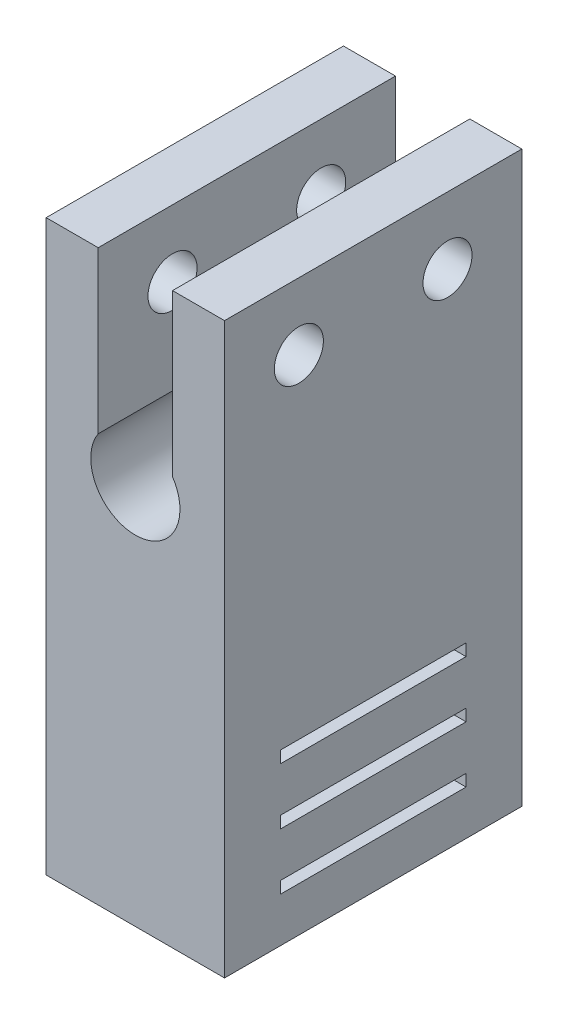
ISO-10303-21;
HEADER;
FILE_DESCRIPTION(('STEP AP214'),'2;1');
FILE_NAME('part.step','',(''),(''),'','','');
FILE_SCHEMA(('AUTOMOTIVE_DESIGN { 1 0 10303 214 1 1 1 1 }'));
ENDSEC;
DATA;
#1=APPLICATION_CONTEXT('core data for automotive mechanical design processes');
#2=APPLICATION_PROTOCOL_DEFINITION('international standard','automotive_design',2000,#1);
#3=PRODUCT_CONTEXT('',#1,'mechanical');
#4=PRODUCT('Part','Part','',(#3));
#5=PRODUCT_RELATED_PRODUCT_CATEGORY('part','',(#4));
#6=PRODUCT_DEFINITION_FORMATION('','',#4);
#7=PRODUCT_DEFINITION_CONTEXT('part definition',#1,'design');
#8=PRODUCT_DEFINITION('design','',#6,#7);
#9=PRODUCT_DEFINITION_SHAPE('','',#8);
#10=(LENGTH_UNIT() NAMED_UNIT(*) SI_UNIT(.MILLI.,.METRE.));
#11=(NAMED_UNIT(*) PLANE_ANGLE_UNIT() SI_UNIT($,.RADIAN.));
#12=(NAMED_UNIT(*) SI_UNIT($,.STERADIAN.) SOLID_ANGLE_UNIT());
#13=UNCERTAINTY_MEASURE_WITH_UNIT(LENGTH_MEASURE(1.E-05),#10,'distance_accuracy_value','');
#14=(GEOMETRIC_REPRESENTATION_CONTEXT(3) GLOBAL_UNCERTAINTY_ASSIGNED_CONTEXT((#13)) GLOBAL_UNIT_ASSIGNED_CONTEXT((#10,
#11,#12)) REPRESENTATION_CONTEXT('',''));
#15=CARTESIAN_POINT('',(0.,0.,0.));
#16=DIRECTION('',(0.,0.,1.));
#17=DIRECTION('',(1.,0.,0.));
#18=AXIS2_PLACEMENT_3D('',#15,#16,#17);
#19=CARTESIAN_POINT('',(12.,38.3,0.));
#20=DIRECTION('',(0.,-1.,0.));
#21=DIRECTION('',(0.,0.,-1.));
#22=AXIS2_PLACEMENT_3D('',#19,#20,#21);
#23=PLANE('',#22);
#24=DIRECTION('',(-1.,0.,0.));
#25=VECTOR('',#24,1.);
#26=CARTESIAN_POINT('',(12.,38.3,0.));
#27=LINE('',#26,#25);
#28=CARTESIAN_POINT('',(3.5,38.3,0.));
#29=VERTEX_POINT('',#28);
#30=CARTESIAN_POINT('',(0.,38.3,0.));
#31=VERTEX_POINT('',#30);
#32=EDGE_CURVE('E337',#29,#31,#27,.T.);
#33=ORIENTED_EDGE('',*,*,#32,.F.);
#34=DIRECTION('',(0.,0.,1.));
#35=VECTOR('',#34,1.);
#36=CARTESIAN_POINT('',(3.5,38.3,-20.));
#37=LINE('',#36,#35);
#38=CARTESIAN_POINT('',(3.5,38.3,-20.));
#39=VERTEX_POINT('',#38);
#40=EDGE_CURVE('E197',#39,#29,#37,.T.);
#41=ORIENTED_EDGE('',*,*,#40,.F.);
#42=DIRECTION('',(-1.,0.,0.));
#43=VECTOR('',#42,1.);
#44=CARTESIAN_POINT('',(12.,38.3,-20.));
#45=LINE('',#44,#43);
#46=CARTESIAN_POINT('',(0.,38.3,-20.));
#47=VERTEX_POINT('',#46);
#48=EDGE_CURVE('E41',#39,#47,#45,.T.);
#49=ORIENTED_EDGE('',*,*,#48,.T.);
#50=DIRECTION('',(0.,0.,1.));
#51=VECTOR('',#50,1.);
#52=CARTESIAN_POINT('',(0.,38.3,0.));
#53=LINE('',#52,#51);
#54=EDGE_CURVE('E326',#47,#31,#53,.T.);
#55=ORIENTED_EDGE('',*,*,#54,.T.);
#56=EDGE_LOOP('',(#33,#41,#49,#55));
#57=FACE_BOUND('',#56,.T.);
#58=ADVANCED_FACE('F32',(#57),#23,.F.);
#59=CARTESIAN_POINT('',(12.,33.8,-5.));
#60=DIRECTION('',(-1.,0.,0.));
#61=DIRECTION('',(0.,0.,1.));
#62=AXIS2_PLACEMENT_3D('',#59,#60,#61);
#63=CYLINDRICAL_SURFACE('',#62,1.65);
#64=CARTESIAN_POINT('',(3.5,33.8,-5.));
#65=DIRECTION('',(-1.,0.,0.));
#66=DIRECTION('',(0.,-1.,0.));
#67=AXIS2_PLACEMENT_3D('',#64,#65,#66);
#68=CIRCLE('',#67,1.65);
#69=CARTESIAN_POINT('',(3.5,32.15,-5.));
#70=VERTEX_POINT('',#69);
#71=EDGE_CURVE('E207',#70,#70,#68,.T.);
#72=ORIENTED_EDGE('',*,*,#71,.F.);
#73=EDGE_LOOP('',(#72));
#74=FACE_BOUND('',#73,.T.);
#75=CARTESIAN_POINT('',(0.,33.8,-5.));
#76=DIRECTION('',(1.,0.,0.));
#77=DIRECTION('',(0.,0.,-1.));
#78=AXIS2_PLACEMENT_3D('',#75,#76,#77);
#79=CIRCLE('',#78,1.65);
#80=CARTESIAN_POINT('',(0.,33.8,-6.65));
#81=VERTEX_POINT('',#80);
#82=EDGE_CURVE('E214',#81,#81,#79,.T.);
#83=ORIENTED_EDGE('',*,*,#82,.F.);
#84=EDGE_LOOP('',(#83));
#85=FACE_BOUND('',#84,.T.);
#86=ADVANCED_FACE('F365',(#74,#85),#63,.F.);
#87=CARTESIAN_POINT('',(12.,33.8,-15.));
#88=DIRECTION('',(-1.,0.,0.));
#89=DIRECTION('',(0.,0.,1.));
#90=AXIS2_PLACEMENT_3D('',#87,#88,#89);
#91=CYLINDRICAL_SURFACE('',#90,1.65);
#92=CARTESIAN_POINT('',(3.5,33.8,-15.));
#93=DIRECTION('',(-1.,0.,0.));
#94=DIRECTION('',(0.,-1.,0.));
#95=AXIS2_PLACEMENT_3D('',#92,#93,#94);
#96=CIRCLE('',#95,1.65);
#97=CARTESIAN_POINT('',(3.5,32.15,-15.));
#98=VERTEX_POINT('',#97);
#99=EDGE_CURVE('E36',#98,#98,#96,.T.);
#100=ORIENTED_EDGE('',*,*,#99,.F.);
#101=EDGE_LOOP('',(#100));
#102=FACE_BOUND('',#101,.T.);
#103=CARTESIAN_POINT('',(0.,33.8,-15.));
#104=DIRECTION('',(1.,0.,0.));
#105=DIRECTION('',(0.,0.,-1.));
#106=AXIS2_PLACEMENT_3D('',#103,#104,#105);
#107=CIRCLE('',#106,1.65);
#108=CARTESIAN_POINT('',(0.,33.8,-16.65));
#109=VERTEX_POINT('',#108);
#110=EDGE_CURVE('E210',#109,#109,#107,.T.);
#111=ORIENTED_EDGE('',*,*,#110,.F.);
#112=EDGE_LOOP('',(#111));
#113=FACE_BOUND('',#112,.T.);
#114=ADVANCED_FACE('F351',(#102,#113),#91,.F.);
#115=CARTESIAN_POINT('',(12.,38.3,-20.));
#116=DIRECTION('',(-1.,0.,0.));
#117=DIRECTION('',(0.,0.,1.));
#118=AXIS2_PLACEMENT_3D('',#115,#116,#117);
#119=PLANE('',#118);
#120=CARTESIAN_POINT('',(12.,33.8,-5.));
#121=DIRECTION('',(1.,0.,0.));
#122=DIRECTION('',(0.,0.,-1.));
#123=AXIS2_PLACEMENT_3D('',#120,#121,#122);
#124=CIRCLE('',#123,1.65);
#125=CARTESIAN_POINT('',(12.,33.8,-6.65));
#126=VERTEX_POINT('',#125);
#127=EDGE_CURVE('E217',#126,#126,#124,.T.);
#128=ORIENTED_EDGE('',*,*,#127,.F.);
#129=EDGE_LOOP('',(#128));
#130=FACE_BOUND('',#129,.T.);
#131=DIRECTION('',(0.,-1.,0.));
#132=VECTOR('',#131,1.);
#133=CARTESIAN_POINT('',(12.,7.59999999999998,-3.74999999999999));
#134=LINE('',#133,#132);
#135=CARTESIAN_POINT('',(12.,7.59999999999998,-3.74999999999999));
#136=VERTEX_POINT('',#135);
#137=CARTESIAN_POINT('',(12.,6.79999999999999,-3.74999999999999));
#138=VERTEX_POINT('',#137);
#139=EDGE_CURVE('E252',#136,#138,#134,.T.);
#140=ORIENTED_EDGE('',*,*,#139,.F.);
#141=DIRECTION('',(0.,0.,1.));
#142=VECTOR('',#141,1.);
#143=CARTESIAN_POINT('',(12.,7.59999999999998,-3.74999999999999));
#144=LINE('',#143,#142);
#145=CARTESIAN_POINT('',(12.,7.59999999999998,-16.25));
#146=VERTEX_POINT('',#145);
#147=EDGE_CURVE('E260',#146,#136,#144,.T.);
#148=ORIENTED_EDGE('',*,*,#147,.F.);
#149=DIRECTION('',(0.,1.,0.));
#150=VECTOR('',#149,1.);
#151=CARTESIAN_POINT('',(12.,7.59999999999998,-16.25));
#152=LINE('',#151,#150);
#153=CARTESIAN_POINT('',(12.,6.79999999999999,-16.25));
#154=VERTEX_POINT('',#153);
#155=EDGE_CURVE('E257',#154,#146,#152,.T.);
#156=ORIENTED_EDGE('',*,*,#155,.F.);
#157=DIRECTION('',(0.,0.,-1.));
#158=VECTOR('',#157,1.);
#159=CARTESIAN_POINT('',(12.,6.79999999999999,-3.74999999999999));
#160=LINE('',#159,#158);
#161=EDGE_CURVE('E254',#138,#154,#160,.T.);
#162=ORIENTED_EDGE('',*,*,#161,.F.);
#163=EDGE_LOOP('',(#140,#148,#156,#162));
#164=FACE_BOUND('',#163,.T.);
#165=DIRECTION('',(0.,1.,0.));
#166=VECTOR('',#165,1.);
#167=CARTESIAN_POINT('',(12.,0.,-20.));
#168=LINE('',#167,#166);
#169=CARTESIAN_POINT('',(12.,0.,-20.));
#170=VERTEX_POINT('',#169);
#171=CARTESIAN_POINT('',(12.,38.3,-20.));
#172=VERTEX_POINT('',#171);
#173=EDGE_CURVE('E314',#170,#172,#168,.T.);
#174=ORIENTED_EDGE('',*,*,#173,.T.);
#175=DIRECTION('',(0.,0.,1.));
#176=VECTOR('',#175,1.);
#177=CARTESIAN_POINT('',(12.,38.3,0.));
#178=LINE('',#177,#176);
#179=CARTESIAN_POINT('',(12.,38.3,0.));
#180=VERTEX_POINT('',#179);
#181=EDGE_CURVE('E317',#172,#180,#178,.T.);
#182=ORIENTED_EDGE('',*,*,#181,.T.);
#183=DIRECTION('',(0.,-1.,0.));
#184=VECTOR('',#183,1.);
#185=CARTESIAN_POINT('',(12.,0.,0.));
#186=LINE('',#185,#184);
#187=CARTESIAN_POINT('',(12.,0.,0.));
#188=VERTEX_POINT('',#187);
#189=EDGE_CURVE('E320',#180,#188,#186,.T.);
#190=ORIENTED_EDGE('',*,*,#189,.T.);
#191=DIRECTION('',(0.,0.,-1.));
#192=VECTOR('',#191,1.);
#193=CARTESIAN_POINT('',(12.,0.,0.));
#194=LINE('',#193,#192);
#195=EDGE_CURVE('E322',#188,#170,#194,.T.);
#196=ORIENTED_EDGE('',*,*,#195,.T.);
#197=EDGE_LOOP('',(#174,#182,#190,#196));
#198=FACE_BOUND('',#197,.T.);
#199=DIRECTION('',(0.,-1.,0.));
#200=VECTOR('',#199,1.);
#201=CARTESIAN_POINT('',(12.,3.79999999999999,-3.74999999999999));
#202=LINE('',#201,#200);
#203=CARTESIAN_POINT('',(12.,3.79999999999999,-3.74999999999999));
#204=VERTEX_POINT('',#203);
#205=CARTESIAN_POINT('',(12.,3.,-3.74999999999999));
#206=VERTEX_POINT('',#205);
#207=EDGE_CURVE('E283',#204,#206,#202,.T.);
#208=ORIENTED_EDGE('',*,*,#207,.F.);
#209=DIRECTION('',(0.,0.,1.));
#210=VECTOR('',#209,1.);
#211=CARTESIAN_POINT('',(12.,3.79999999999999,-3.74999999999999));
#212=LINE('',#211,#210);
#213=CARTESIAN_POINT('',(12.,3.79999999999999,-16.25));
#214=VERTEX_POINT('',#213);
#215=EDGE_CURVE('E291',#214,#204,#212,.T.);
#216=ORIENTED_EDGE('',*,*,#215,.F.);
#217=DIRECTION('',(0.,1.,0.));
#218=VECTOR('',#217,1.);
#219=CARTESIAN_POINT('',(12.,3.79999999999999,-16.25));
#220=LINE('',#219,#218);
#221=CARTESIAN_POINT('',(12.,3.,-16.25));
#222=VERTEX_POINT('',#221);
#223=EDGE_CURVE('E288',#222,#214,#220,.T.);
#224=ORIENTED_EDGE('',*,*,#223,.F.);
#225=DIRECTION('',(0.,0.,-1.));
#226=VECTOR('',#225,1.);
#227=CARTESIAN_POINT('',(12.,3.,-3.74999999999999));
#228=LINE('',#227,#226);
#229=EDGE_CURVE('E285',#206,#222,#228,.T.);
#230=ORIENTED_EDGE('',*,*,#229,.F.);
#231=EDGE_LOOP('',(#208,#216,#224,#230));
#232=FACE_BOUND('',#231,.T.);
#233=DIRECTION('',(0.,-1.,0.));
#234=VECTOR('',#233,1.);
#235=CARTESIAN_POINT('',(12.,10.6,-3.74999999999999));
#236=LINE('',#235,#234);
#237=CARTESIAN_POINT('',(12.,11.4,-3.74999999999999));
#238=VERTEX_POINT('',#237);
#239=CARTESIAN_POINT('',(12.,10.6,-3.74999999999999));
#240=VERTEX_POINT('',#239);
#241=EDGE_CURVE('E223',#238,#240,#236,.T.);
#242=ORIENTED_EDGE('',*,*,#241,.F.);
#243=DIRECTION('',(0.,0.,1.));
#244=VECTOR('',#243,1.);
#245=CARTESIAN_POINT('',(12.,11.4,-3.74999999999999));
#246=LINE('',#245,#244);
#247=CARTESIAN_POINT('',(12.,11.4,-16.25));
#248=VERTEX_POINT('',#247);
#249=EDGE_CURVE('E230',#248,#238,#246,.T.);
#250=ORIENTED_EDGE('',*,*,#249,.F.);
#251=DIRECTION('',(0.,1.,0.));
#252=VECTOR('',#251,1.);
#253=CARTESIAN_POINT('',(12.,10.6,-16.25));
#254=LINE('',#253,#252);
#255=CARTESIAN_POINT('',(12.,10.6,-16.25));
#256=VERTEX_POINT('',#255);
#257=EDGE_CURVE('E228',#256,#248,#254,.T.);
#258=ORIENTED_EDGE('',*,*,#257,.F.);
#259=DIRECTION('',(0.,0.,-1.));
#260=VECTOR('',#259,1.);
#261=CARTESIAN_POINT('',(12.,10.6,-3.74999999999999));
#262=LINE('',#261,#260);
#263=EDGE_CURVE('E225',#240,#256,#262,.T.);
#264=ORIENTED_EDGE('',*,*,#263,.F.);
#265=EDGE_LOOP('',(#242,#250,#258,#264));
#266=FACE_BOUND('',#265,.T.);
#267=CARTESIAN_POINT('',(12.,33.8,-15.));
#268=DIRECTION('',(1.,0.,0.));
#269=DIRECTION('',(0.,0.,-1.));
#270=AXIS2_PLACEMENT_3D('',#267,#268,#269);
#271=CIRCLE('',#270,1.65);
#272=CARTESIAN_POINT('',(12.,33.8,-16.65));
#273=VERTEX_POINT('',#272);
#274=EDGE_CURVE('E211',#273,#273,#271,.T.);
#275=ORIENTED_EDGE('',*,*,#274,.F.);
#276=EDGE_LOOP('',(#275));
#277=FACE_BOUND('',#276,.T.);
#278=ADVANCED_FACE('F354',(#130,#164,#198,#232,#266,#277),#119,.F.);
#279=CARTESIAN_POINT('',(0.,38.3,-20.));
#280=DIRECTION('',(-1.,0.,0.));
#281=DIRECTION('',(0.,0.,1.));
#282=AXIS2_PLACEMENT_3D('',#279,#280,#281);
#283=PLANE('',#282);
#284=ORIENTED_EDGE('',*,*,#82,.T.);
#285=EDGE_LOOP('',(#284));
#286=FACE_BOUND('',#285,.T.);
#287=DIRECTION('',(0.,0.,1.));
#288=VECTOR('',#287,1.);
#289=CARTESIAN_POINT('',(0.,7.59999999999998,-3.74999999999999));
#290=LINE('',#289,#288);
#291=CARTESIAN_POINT('',(0.,7.59999999999998,-16.25));
#292=VERTEX_POINT('',#291);
#293=CARTESIAN_POINT('',(0.,7.59999999999998,-3.74999999999999));
#294=VERTEX_POINT('',#293);
#295=EDGE_CURVE('E255',#292,#294,#290,.T.);
#296=ORIENTED_EDGE('',*,*,#295,.T.);
#297=DIRECTION('',(0.,-1.,0.));
#298=VECTOR('',#297,1.);
#299=CARTESIAN_POINT('',(0.,7.59999999999998,-3.74999999999999));
#300=LINE('',#299,#298);
#301=CARTESIAN_POINT('',(0.,6.79999999999999,-3.74999999999999));
#302=VERTEX_POINT('',#301);
#303=EDGE_CURVE('E251',#294,#302,#300,.T.);
#304=ORIENTED_EDGE('',*,*,#303,.T.);
#305=DIRECTION('',(0.,0.,-1.));
#306=VECTOR('',#305,1.);
#307=CARTESIAN_POINT('',(0.,6.79999999999999,-3.74999999999999));
#308=LINE('',#307,#306);
#309=CARTESIAN_POINT('',(0.,6.79999999999999,-16.25));
#310=VERTEX_POINT('',#309);
#311=EDGE_CURVE('E265',#302,#310,#308,.T.);
#312=ORIENTED_EDGE('',*,*,#311,.T.);
#313=DIRECTION('',(0.,1.,0.));
#314=VECTOR('',#313,1.);
#315=CARTESIAN_POINT('',(0.,7.59999999999998,-16.25));
#316=LINE('',#315,#314);
#317=EDGE_CURVE('E268',#310,#292,#316,.T.);
#318=ORIENTED_EDGE('',*,*,#317,.T.);
#319=EDGE_LOOP('',(#296,#304,#312,#318));
#320=FACE_BOUND('',#319,.T.);
#321=DIRECTION('',(0.,1.,0.));
#322=VECTOR('',#321,1.);
#323=CARTESIAN_POINT('',(0.,0.,-20.));
#324=LINE('',#323,#322);
#325=CARTESIAN_POINT('',(0.,0.,-20.));
#326=VERTEX_POINT('',#325);
#327=EDGE_CURVE('E313',#326,#47,#324,.T.);
#328=ORIENTED_EDGE('',*,*,#327,.F.);
#329=DIRECTION('',(0.,0.,-1.));
#330=VECTOR('',#329,1.);
#331=CARTESIAN_POINT('',(0.,0.,0.));
#332=LINE('',#331,#330);
#333=CARTESIAN_POINT('',(0.,0.,0.));
#334=VERTEX_POINT('',#333);
#335=EDGE_CURVE('E318',#334,#326,#332,.T.);
#336=ORIENTED_EDGE('',*,*,#335,.F.);
#337=DIRECTION('',(0.,-1.,0.));
#338=VECTOR('',#337,1.);
#339=CARTESIAN_POINT('',(0.,0.,0.));
#340=LINE('',#339,#338);
#341=EDGE_CURVE('E329',#31,#334,#340,.T.);
#342=ORIENTED_EDGE('',*,*,#341,.F.);
#343=ORIENTED_EDGE('',*,*,#54,.F.);
#344=EDGE_LOOP('',(#328,#336,#342,#343));
#345=FACE_BOUND('',#344,.T.);
#346=DIRECTION('',(0.,0.,1.));
#347=VECTOR('',#346,1.);
#348=CARTESIAN_POINT('',(0.,3.79999999999999,-3.74999999999999));
#349=LINE('',#348,#347);
#350=CARTESIAN_POINT('',(0.,3.79999999999999,-16.25));
#351=VERTEX_POINT('',#350);
#352=CARTESIAN_POINT('',(0.,3.79999999999999,-3.74999999999999));
#353=VERTEX_POINT('',#352);
#354=EDGE_CURVE('E286',#351,#353,#349,.T.);
#355=ORIENTED_EDGE('',*,*,#354,.T.);
#356=DIRECTION('',(0.,-1.,0.));
#357=VECTOR('',#356,1.);
#358=CARTESIAN_POINT('',(0.,3.79999999999999,-3.74999999999999));
#359=LINE('',#358,#357);
#360=CARTESIAN_POINT('',(0.,3.,-3.74999999999999));
#361=VERTEX_POINT('',#360);
#362=EDGE_CURVE('E282',#353,#361,#359,.T.);
#363=ORIENTED_EDGE('',*,*,#362,.T.);
#364=DIRECTION('',(0.,0.,-1.));
#365=VECTOR('',#364,1.);
#366=CARTESIAN_POINT('',(0.,3.,-3.74999999999999));
#367=LINE('',#366,#365);
#368=CARTESIAN_POINT('',(0.,3.,-16.25));
#369=VERTEX_POINT('',#368);
#370=EDGE_CURVE('E296',#361,#369,#367,.T.);
#371=ORIENTED_EDGE('',*,*,#370,.T.);
#372=DIRECTION('',(0.,1.,0.));
#373=VECTOR('',#372,1.);
#374=CARTESIAN_POINT('',(0.,3.79999999999999,-16.25));
#375=LINE('',#374,#373);
#376=EDGE_CURVE('E299',#369,#351,#375,.T.);
#377=ORIENTED_EDGE('',*,*,#376,.T.);
#378=EDGE_LOOP('',(#355,#363,#371,#377));
#379=FACE_BOUND('',#378,.T.);
#380=DIRECTION('',(0.,0.,1.));
#381=VECTOR('',#380,1.);
#382=CARTESIAN_POINT('',(0.,11.4,-3.74999999999999));
#383=LINE('',#382,#381);
#384=CARTESIAN_POINT('',(0.,11.4,-16.25));
#385=VERTEX_POINT('',#384);
#386=CARTESIAN_POINT('',(0.,11.4,-3.74999999999999));
#387=VERTEX_POINT('',#386);
#388=EDGE_CURVE('E226',#385,#387,#383,.T.);
#389=ORIENTED_EDGE('',*,*,#388,.T.);
#390=DIRECTION('',(0.,-1.,0.));
#391=VECTOR('',#390,1.);
#392=CARTESIAN_POINT('',(0.,10.6,-3.74999999999999));
#393=LINE('',#392,#391);
#394=CARTESIAN_POINT('',(0.,10.6,-3.74999999999999));
#395=VERTEX_POINT('',#394);
#396=EDGE_CURVE('E220',#387,#395,#393,.T.);
#397=ORIENTED_EDGE('',*,*,#396,.T.);
#398=DIRECTION('',(0.,0.,-1.));
#399=VECTOR('',#398,1.);
#400=CARTESIAN_POINT('',(0.,10.6,-3.74999999999999));
#401=LINE('',#400,#399);
#402=CARTESIAN_POINT('',(0.,10.6,-16.25));
#403=VERTEX_POINT('',#402);
#404=EDGE_CURVE('E235',#395,#403,#401,.T.);
#405=ORIENTED_EDGE('',*,*,#404,.T.);
#406=DIRECTION('',(0.,1.,0.));
#407=VECTOR('',#406,1.);
#408=CARTESIAN_POINT('',(0.,10.6,-16.25));
#409=LINE('',#408,#407);
#410=EDGE_CURVE('E238',#403,#385,#409,.T.);
#411=ORIENTED_EDGE('',*,*,#410,.T.);
#412=EDGE_LOOP('',(#389,#397,#405,#411));
#413=FACE_BOUND('',#412,.T.);
#414=ORIENTED_EDGE('',*,*,#110,.T.);
#415=EDGE_LOOP('',(#414));
#416=FACE_BOUND('',#415,.T.);
#417=ADVANCED_FACE('F356',(#286,#320,#345,#379,#413,#416),#283,.T.);
#418=CARTESIAN_POINT('',(12.,0.,-20.));
#419=DIRECTION('',(0.,0.,1.));
#420=DIRECTION('',(1.,0.,0.));
#421=AXIS2_PLACEMENT_3D('',#418,#419,#420);
#422=PLANE('',#421);
#423=ORIENTED_EDGE('',*,*,#48,.F.);
#424=DIRECTION('',(0.,-1.,0.));
#425=VECTOR('',#424,1.);
#426=CARTESIAN_POINT('',(3.5,38.3,-20.));
#427=LINE('',#426,#425);
#428=CARTESIAN_POINT('',(3.5,27.4583123951777,-20.));
#429=VERTEX_POINT('',#428);
#430=EDGE_CURVE('E172',#39,#429,#427,.T.);
#431=ORIENTED_EDGE('',*,*,#430,.T.);
#432=CARTESIAN_POINT('',(6.,25.8,-20.));
#433=DIRECTION('',(0.,0.,1.));
#434=DIRECTION('',(1.,0.,0.));
#435=AXIS2_PLACEMENT_3D('',#432,#433,#434);
#436=CIRCLE('',#435,3.);
#437=CARTESIAN_POINT('',(8.5,27.4583123951777,-20.));
#438=VERTEX_POINT('',#437);
#439=EDGE_CURVE('E181',#429,#438,#436,.T.);
#440=ORIENTED_EDGE('',*,*,#439,.T.);
#441=DIRECTION('',(0.,1.,0.));
#442=VECTOR('',#441,1.);
#443=CARTESIAN_POINT('',(8.5,38.3,-20.));
#444=LINE('',#443,#442);
#445=CARTESIAN_POINT('',(8.5,38.3,-20.));
#446=VERTEX_POINT('',#445);
#447=EDGE_CURVE('E178',#438,#446,#444,.T.);
#448=ORIENTED_EDGE('',*,*,#447,.T.);
#449=EDGE_CURVE('E11',#172,#446,#45,.T.);
#450=ORIENTED_EDGE('',*,*,#449,.F.);
#451=ORIENTED_EDGE('',*,*,#173,.F.);
#452=DIRECTION('',(-1.,0.,0.));
#453=VECTOR('',#452,1.);
#454=CARTESIAN_POINT('',(12.,0.,-20.));
#455=LINE('',#454,#453);
#456=EDGE_CURVE('E324',#170,#326,#455,.T.);
#457=ORIENTED_EDGE('',*,*,#456,.T.);
#458=ORIENTED_EDGE('',*,*,#327,.T.);
#459=EDGE_LOOP('',(#423,#431,#440,#448,#450,#451,#457,#458));
#460=FACE_BOUND('',#459,.T.);
#461=ADVANCED_FACE('F34',(#460),#422,.F.);
#462=ORIENTED_EDGE('',*,*,#449,.T.);
#463=DIRECTION('',(0.,0.,1.));
#464=VECTOR('',#463,1.);
#465=CARTESIAN_POINT('',(8.5,38.3,-20.));
#466=LINE('',#465,#464);
#467=CARTESIAN_POINT('',(8.5,38.3,0.));
#468=VERTEX_POINT('',#467);
#469=EDGE_CURVE('E200',#446,#468,#466,.T.);
#470=ORIENTED_EDGE('',*,*,#469,.T.);
#471=EDGE_CURVE('E338',#180,#468,#27,.T.);
#472=ORIENTED_EDGE('',*,*,#471,.F.);
#473=ORIENTED_EDGE('',*,*,#181,.F.);
#474=EDGE_LOOP('',(#462,#470,#472,#473));
#475=FACE_BOUND('',#474,.T.);
#476=ADVANCED_FACE('F372',(#475),#23,.F.);
#477=CARTESIAN_POINT('',(12.,0.,0.));
#478=DIRECTION('',(0.,0.,-1.));
#479=DIRECTION('',(-1.,0.,0.));
#480=AXIS2_PLACEMENT_3D('',#477,#478,#479);
#481=PLANE('',#480);
#482=CARTESIAN_POINT('',(6.,25.8,0.));
#483=DIRECTION('',(0.,0.,1.));
#484=DIRECTION('',(1.,0.,0.));
#485=AXIS2_PLACEMENT_3D('',#482,#483,#484);
#486=CIRCLE('',#485,3.);
#487=CARTESIAN_POINT('',(3.5,27.4583123951777,0.));
#488=VERTEX_POINT('',#487);
#489=CARTESIAN_POINT('',(8.5,27.4583123951777,0.));
#490=VERTEX_POINT('',#489);
#491=EDGE_CURVE('E191',#488,#490,#486,.T.);
#492=ORIENTED_EDGE('',*,*,#491,.F.);
#493=DIRECTION('',(0.,-1.,0.));
#494=VECTOR('',#493,1.);
#495=CARTESIAN_POINT('',(3.5,38.3,0.));
#496=LINE('',#495,#494);
#497=EDGE_CURVE('E49',#29,#488,#496,.T.);
#498=ORIENTED_EDGE('',*,*,#497,.F.);
#499=ORIENTED_EDGE('',*,*,#32,.T.);
#500=ORIENTED_EDGE('',*,*,#341,.T.);
#501=DIRECTION('',(-1.,0.,0.));
#502=VECTOR('',#501,1.);
#503=CARTESIAN_POINT('',(12.,0.,0.));
#504=LINE('',#503,#502);
#505=EDGE_CURVE('E334',#188,#334,#504,.T.);
#506=ORIENTED_EDGE('',*,*,#505,.F.);
#507=ORIENTED_EDGE('',*,*,#189,.F.);
#508=ORIENTED_EDGE('',*,*,#471,.T.);
#509=DIRECTION('',(0.,1.,0.));
#510=VECTOR('',#509,1.);
#511=CARTESIAN_POINT('',(8.5,38.3,0.));
#512=LINE('',#511,#510);
#513=EDGE_CURVE('E189',#490,#468,#512,.T.);
#514=ORIENTED_EDGE('',*,*,#513,.F.);
#515=EDGE_LOOP('',(#492,#498,#499,#500,#506,#507,#508,#514));
#516=FACE_BOUND('',#515,.T.);
#517=ADVANCED_FACE('F381',(#516),#481,.F.);
#518=CARTESIAN_POINT('',(12.,0.,0.));
#519=DIRECTION('',(0.,1.,0.));
#520=DIRECTION('',(0.,0.,1.));
#521=AXIS2_PLACEMENT_3D('',#518,#519,#520);
#522=PLANE('',#521);
#523=ORIENTED_EDGE('',*,*,#335,.T.);
#524=ORIENTED_EDGE('',*,*,#456,.F.);
#525=ORIENTED_EDGE('',*,*,#195,.F.);
#526=ORIENTED_EDGE('',*,*,#505,.T.);
#527=EDGE_LOOP('',(#523,#524,#525,#526));
#528=FACE_BOUND('',#527,.T.);
#529=ADVANCED_FACE('F387',(#528),#522,.F.);
#530=CARTESIAN_POINT('',(12.,3.79999999999999,-3.74999999999999));
#531=DIRECTION('',(0.,0.,-1.));
#532=DIRECTION('',(-1.,0.,0.));
#533=AXIS2_PLACEMENT_3D('',#530,#531,#532);
#534=PLANE('',#533);
#535=ORIENTED_EDGE('',*,*,#362,.F.);
#536=DIRECTION('',(-1.,0.,0.));
#537=VECTOR('',#536,1.);
#538=CARTESIAN_POINT('',(12.,3.79999999999999,-3.74999999999999));
#539=LINE('',#538,#537);
#540=EDGE_CURVE('E293',#204,#353,#539,.T.);
#541=ORIENTED_EDGE('',*,*,#540,.F.);
#542=ORIENTED_EDGE('',*,*,#207,.T.);
#543=DIRECTION('',(-1.,0.,0.));
#544=VECTOR('',#543,1.);
#545=CARTESIAN_POINT('',(12.,3.,-3.74999999999999));
#546=LINE('',#545,#544);
#547=EDGE_CURVE('E310',#206,#361,#546,.T.);
#548=ORIENTED_EDGE('',*,*,#547,.T.);
#549=EDGE_LOOP('',(#535,#541,#542,#548));
#550=FACE_BOUND('',#549,.T.);
#551=ADVANCED_FACE('F464',(#550),#534,.T.);
#552=CARTESIAN_POINT('',(12.,3.,-3.74999999999999));
#553=DIRECTION('',(0.,1.,0.));
#554=DIRECTION('',(0.,0.,1.));
#555=AXIS2_PLACEMENT_3D('',#552,#553,#554);
#556=PLANE('',#555);
#557=ORIENTED_EDGE('',*,*,#370,.F.);
#558=ORIENTED_EDGE('',*,*,#547,.F.);
#559=ORIENTED_EDGE('',*,*,#229,.T.);
#560=DIRECTION('',(-1.,0.,0.));
#561=VECTOR('',#560,1.);
#562=CARTESIAN_POINT('',(12.,3.,-16.25));
#563=LINE('',#562,#561);
#564=EDGE_CURVE('E308',#222,#369,#563,.T.);
#565=ORIENTED_EDGE('',*,*,#564,.T.);
#566=EDGE_LOOP('',(#557,#558,#559,#565));
#567=FACE_BOUND('',#566,.T.);
#568=ADVANCED_FACE('F461',(#567),#556,.T.);
#569=CARTESIAN_POINT('',(12.,3.79999999999999,-16.25));
#570=DIRECTION('',(0.,0.,1.));
#571=DIRECTION('',(1.,0.,0.));
#572=AXIS2_PLACEMENT_3D('',#569,#570,#571);
#573=PLANE('',#572);
#574=ORIENTED_EDGE('',*,*,#376,.F.);
#575=ORIENTED_EDGE('',*,*,#564,.F.);
#576=ORIENTED_EDGE('',*,*,#223,.T.);
#577=DIRECTION('',(-1.,0.,0.));
#578=VECTOR('',#577,1.);
#579=CARTESIAN_POINT('',(12.,3.79999999999999,-16.25));
#580=LINE('',#579,#578);
#581=EDGE_CURVE('E306',#214,#351,#580,.T.);
#582=ORIENTED_EDGE('',*,*,#581,.T.);
#583=EDGE_LOOP('',(#574,#575,#576,#582));
#584=FACE_BOUND('',#583,.T.);
#585=ADVANCED_FACE('F457',(#584),#573,.T.);
#586=CARTESIAN_POINT('',(12.,3.79999999999999,-3.74999999999999));
#587=DIRECTION('',(0.,-1.,0.));
#588=DIRECTION('',(0.,0.,-1.));
#589=AXIS2_PLACEMENT_3D('',#586,#587,#588);
#590=PLANE('',#589);
#591=ORIENTED_EDGE('',*,*,#354,.F.);
#592=ORIENTED_EDGE('',*,*,#581,.F.);
#593=ORIENTED_EDGE('',*,*,#215,.T.);
#594=ORIENTED_EDGE('',*,*,#540,.T.);
#595=EDGE_LOOP('',(#591,#592,#593,#594));
#596=FACE_BOUND('',#595,.T.);
#597=ADVANCED_FACE('F453',(#596),#590,.T.);
#598=CARTESIAN_POINT('',(12.,7.59999999999998,-3.74999999999999));
#599=DIRECTION('',(0.,0.,-1.));
#600=DIRECTION('',(-1.,0.,0.));
#601=AXIS2_PLACEMENT_3D('',#598,#599,#600);
#602=PLANE('',#601);
#603=ORIENTED_EDGE('',*,*,#303,.F.);
#604=DIRECTION('',(-1.,0.,0.));
#605=VECTOR('',#604,1.);
#606=CARTESIAN_POINT('',(12.,7.59999999999998,-3.74999999999999));
#607=LINE('',#606,#605);
#608=EDGE_CURVE('E262',#136,#294,#607,.T.);
#609=ORIENTED_EDGE('',*,*,#608,.F.);
#610=ORIENTED_EDGE('',*,*,#139,.T.);
#611=DIRECTION('',(-1.,0.,0.));
#612=VECTOR('',#611,1.);
#613=CARTESIAN_POINT('',(12.,6.79999999999999,-3.74999999999999));
#614=LINE('',#613,#612);
#615=EDGE_CURVE('E279',#138,#302,#614,.T.);
#616=ORIENTED_EDGE('',*,*,#615,.T.);
#617=EDGE_LOOP('',(#603,#609,#610,#616));
#618=FACE_BOUND('',#617,.T.);
#619=ADVANCED_FACE('F449',(#618),#602,.T.);
#620=CARTESIAN_POINT('',(12.,6.79999999999999,-3.74999999999999));
#621=DIRECTION('',(0.,1.,0.));
#622=DIRECTION('',(0.,0.,1.));
#623=AXIS2_PLACEMENT_3D('',#620,#621,#622);
#624=PLANE('',#623);
#625=ORIENTED_EDGE('',*,*,#311,.F.);
#626=ORIENTED_EDGE('',*,*,#615,.F.);
#627=ORIENTED_EDGE('',*,*,#161,.T.);
#628=DIRECTION('',(-1.,0.,0.));
#629=VECTOR('',#628,1.);
#630=CARTESIAN_POINT('',(12.,6.79999999999999,-16.25));
#631=LINE('',#630,#629);
#632=EDGE_CURVE('E277',#154,#310,#631,.T.);
#633=ORIENTED_EDGE('',*,*,#632,.T.);
#634=EDGE_LOOP('',(#625,#626,#627,#633));
#635=FACE_BOUND('',#634,.T.);
#636=ADVANCED_FACE('F445',(#635),#624,.T.);
#637=CARTESIAN_POINT('',(12.,7.59999999999998,-16.25));
#638=DIRECTION('',(0.,0.,1.));
#639=DIRECTION('',(0.,-1.,0.));
#640=AXIS2_PLACEMENT_3D('',#637,#638,#639);
#641=PLANE('',#640);
#642=ORIENTED_EDGE('',*,*,#317,.F.);
#643=ORIENTED_EDGE('',*,*,#632,.F.);
#644=ORIENTED_EDGE('',*,*,#155,.T.);
#645=DIRECTION('',(-1.,0.,0.));
#646=VECTOR('',#645,1.);
#647=CARTESIAN_POINT('',(12.,7.59999999999998,-16.25));
#648=LINE('',#647,#646);
#649=EDGE_CURVE('E275',#146,#292,#648,.T.);
#650=ORIENTED_EDGE('',*,*,#649,.T.);
#651=EDGE_LOOP('',(#642,#643,#644,#650));
#652=FACE_BOUND('',#651,.T.);
#653=ADVANCED_FACE('F441',(#652),#641,.T.);
#654=CARTESIAN_POINT('',(12.,7.59999999999998,-3.74999999999999));
#655=DIRECTION('',(0.,-1.,0.));
#656=DIRECTION('',(0.,0.,-1.));
#657=AXIS2_PLACEMENT_3D('',#654,#655,#656);
#658=PLANE('',#657);
#659=ORIENTED_EDGE('',*,*,#295,.F.);
#660=ORIENTED_EDGE('',*,*,#649,.F.);
#661=ORIENTED_EDGE('',*,*,#147,.T.);
#662=ORIENTED_EDGE('',*,*,#608,.T.);
#663=EDGE_LOOP('',(#659,#660,#661,#662));
#664=FACE_BOUND('',#663,.T.);
#665=ADVANCED_FACE('F438',(#664),#658,.T.);
#666=CARTESIAN_POINT('',(12.,10.6,-3.74999999999999));
#667=DIRECTION('',(0.,0.,-1.));
#668=DIRECTION('',(-1.,0.,0.));
#669=AXIS2_PLACEMENT_3D('',#666,#667,#668);
#670=PLANE('',#669);
#671=ORIENTED_EDGE('',*,*,#396,.F.);
#672=DIRECTION('',(-1.,0.,0.));
#673=VECTOR('',#672,1.);
#674=CARTESIAN_POINT('',(12.,11.4,-3.74999999999999));
#675=LINE('',#674,#673);
#676=EDGE_CURVE('E232',#238,#387,#675,.T.);
#677=ORIENTED_EDGE('',*,*,#676,.F.);
#678=ORIENTED_EDGE('',*,*,#241,.T.);
#679=DIRECTION('',(-1.,0.,0.));
#680=VECTOR('',#679,1.);
#681=CARTESIAN_POINT('',(12.,10.6,-3.74999999999999));
#682=LINE('',#681,#680);
#683=EDGE_CURVE('E248',#240,#395,#682,.T.);
#684=ORIENTED_EDGE('',*,*,#683,.T.);
#685=EDGE_LOOP('',(#671,#677,#678,#684));
#686=FACE_BOUND('',#685,.T.);
#687=ADVANCED_FACE('F417',(#686),#670,.T.);
#688=CARTESIAN_POINT('',(12.,10.6,-3.74999999999999));
#689=DIRECTION('',(0.,1.,0.));
#690=DIRECTION('',(0.,0.,1.));
#691=AXIS2_PLACEMENT_3D('',#688,#689,#690);
#692=PLANE('',#691);
#693=ORIENTED_EDGE('',*,*,#404,.F.);
#694=ORIENTED_EDGE('',*,*,#683,.F.);
#695=ORIENTED_EDGE('',*,*,#263,.T.);
#696=DIRECTION('',(-1.,0.,0.));
#697=VECTOR('',#696,1.);
#698=CARTESIAN_POINT('',(12.,10.6,-16.25));
#699=LINE('',#698,#697);
#700=EDGE_CURVE('E246',#256,#403,#699,.T.);
#701=ORIENTED_EDGE('',*,*,#700,.T.);
#702=EDGE_LOOP('',(#693,#694,#695,#701));
#703=FACE_BOUND('',#702,.T.);
#704=ADVANCED_FACE('F424',(#703),#692,.T.);
#705=CARTESIAN_POINT('',(12.,10.6,-16.25));
#706=DIRECTION('',(0.,0.,1.));
#707=DIRECTION('',(0.,-1.,0.));
#708=AXIS2_PLACEMENT_3D('',#705,#706,#707);
#709=PLANE('',#708);
#710=ORIENTED_EDGE('',*,*,#410,.F.);
#711=ORIENTED_EDGE('',*,*,#700,.F.);
#712=ORIENTED_EDGE('',*,*,#257,.T.);
#713=DIRECTION('',(-1.,0.,0.));
#714=VECTOR('',#713,1.);
#715=CARTESIAN_POINT('',(12.,11.4,-16.25));
#716=LINE('',#715,#714);
#717=EDGE_CURVE('E57',#248,#385,#716,.T.);
#718=ORIENTED_EDGE('',*,*,#717,.T.);
#719=EDGE_LOOP('',(#710,#711,#712,#718));
#720=FACE_BOUND('',#719,.T.);
#721=ADVANCED_FACE('F426',(#720),#709,.T.);
#722=CARTESIAN_POINT('',(12.,11.4,-3.74999999999999));
#723=DIRECTION('',(0.,-1.,0.));
#724=DIRECTION('',(0.,0.,-1.));
#725=AXIS2_PLACEMENT_3D('',#722,#723,#724);
#726=PLANE('',#725);
#727=ORIENTED_EDGE('',*,*,#388,.F.);
#728=ORIENTED_EDGE('',*,*,#717,.F.);
#729=ORIENTED_EDGE('',*,*,#249,.T.);
#730=ORIENTED_EDGE('',*,*,#676,.T.);
#731=EDGE_LOOP('',(#727,#728,#729,#730));
#732=FACE_BOUND('',#731,.T.);
#733=ADVANCED_FACE('F412',(#732),#726,.T.);
#734=CARTESIAN_POINT('',(8.5,33.8,-5.));
#735=DIRECTION('',(1.,0.,0.));
#736=DIRECTION('',(0.,1.,0.));
#737=AXIS2_PLACEMENT_3D('',#734,#735,#736);
#738=CIRCLE('',#737,1.65);
#739=CARTESIAN_POINT('',(8.5,35.45,-5.));
#740=VERTEX_POINT('',#739);
#741=EDGE_CURVE('E204',#740,#740,#738,.T.);
#742=ORIENTED_EDGE('',*,*,#741,.F.);
#743=EDGE_LOOP('',(#742));
#744=FACE_BOUND('',#743,.T.);
#745=ORIENTED_EDGE('',*,*,#127,.T.);
#746=EDGE_LOOP('',(#745));
#747=FACE_BOUND('',#746,.T.);
#748=ADVANCED_FACE('F349',(#744,#747),#63,.F.);
#749=CARTESIAN_POINT('',(8.5,33.8,-15.));
#750=DIRECTION('',(1.,0.,0.));
#751=DIRECTION('',(0.,1.,0.));
#752=AXIS2_PLACEMENT_3D('',#749,#750,#751);
#753=CIRCLE('',#752,1.65);
#754=CARTESIAN_POINT('',(8.5,35.45,-15.));
#755=VERTEX_POINT('',#754);
#756=EDGE_CURVE('E199',#755,#755,#753,.T.);
#757=ORIENTED_EDGE('',*,*,#756,.F.);
#758=EDGE_LOOP('',(#757));
#759=FACE_BOUND('',#758,.T.);
#760=ORIENTED_EDGE('',*,*,#274,.T.);
#761=EDGE_LOOP('',(#760));
#762=FACE_BOUND('',#761,.T.);
#763=ADVANCED_FACE('F346',(#759,#762),#91,.F.);
#764=CARTESIAN_POINT('',(3.5,38.3,-20.));
#765=DIRECTION('',(-1.,0.,0.));
#766=DIRECTION('',(0.,-1.,0.));
#767=AXIS2_PLACEMENT_3D('',#764,#765,#766);
#768=PLANE('',#767);
#769=ORIENTED_EDGE('',*,*,#71,.T.);
#770=EDGE_LOOP('',(#769));
#771=FACE_BOUND('',#770,.T.);
#772=ORIENTED_EDGE('',*,*,#99,.T.);
#773=EDGE_LOOP('',(#772));
#774=FACE_BOUND('',#773,.T.);
#775=ORIENTED_EDGE('',*,*,#497,.T.);
#776=DIRECTION('',(0.,0.,1.));
#777=VECTOR('',#776,1.);
#778=CARTESIAN_POINT('',(3.5,27.4583123951777,-20.));
#779=LINE('',#778,#777);
#780=EDGE_CURVE('E168',#429,#488,#779,.T.);
#781=ORIENTED_EDGE('',*,*,#780,.F.);
#782=ORIENTED_EDGE('',*,*,#430,.F.);
#783=ORIENTED_EDGE('',*,*,#40,.T.);
#784=EDGE_LOOP('',(#775,#781,#782,#783));
#785=FACE_BOUND('',#784,.T.);
#786=ADVANCED_FACE('F170',(#771,#774,#785),#768,.F.);
#787=CARTESIAN_POINT('',(8.5,38.3,-20.));
#788=DIRECTION('',(1.,0.,0.));
#789=DIRECTION('',(0.,1.,0.));
#790=AXIS2_PLACEMENT_3D('',#787,#788,#789);
#791=PLANE('',#790);
#792=ORIENTED_EDGE('',*,*,#741,.T.);
#793=EDGE_LOOP('',(#792));
#794=FACE_BOUND('',#793,.T.);
#795=ORIENTED_EDGE('',*,*,#756,.T.);
#796=EDGE_LOOP('',(#795));
#797=FACE_BOUND('',#796,.T.);
#798=ORIENTED_EDGE('',*,*,#513,.T.);
#799=ORIENTED_EDGE('',*,*,#469,.F.);
#800=ORIENTED_EDGE('',*,*,#447,.F.);
#801=DIRECTION('',(0.,0.,1.));
#802=VECTOR('',#801,1.);
#803=CARTESIAN_POINT('',(8.5,27.4583123951777,-20.));
#804=LINE('',#803,#802);
#805=EDGE_CURVE('E177',#438,#490,#804,.T.);
#806=ORIENTED_EDGE('',*,*,#805,.T.);
#807=EDGE_LOOP('',(#798,#799,#800,#806));
#808=FACE_BOUND('',#807,.T.);
#809=ADVANCED_FACE('F343',(#794,#797,#808),#791,.F.);
#810=CARTESIAN_POINT('',(6.,25.8,-20.));
#811=DIRECTION('',(0.,0.,1.));
#812=DIRECTION('',(1.,0.,0.));
#813=AXIS2_PLACEMENT_3D('',#810,#811,#812);
#814=CYLINDRICAL_SURFACE('',#813,3.);
#815=ORIENTED_EDGE('',*,*,#491,.T.);
#816=ORIENTED_EDGE('',*,*,#805,.F.);
#817=ORIENTED_EDGE('',*,*,#439,.F.);
#818=ORIENTED_EDGE('',*,*,#780,.T.);
#819=EDGE_LOOP('',(#815,#816,#817,#818));
#820=FACE_BOUND('',#819,.T.);
#821=ADVANCED_FACE('F182',(#820),#814,.F.);
#822=CLOSED_SHELL('',(#58,#86,#114,#278,#417,#461,#476,#517,#529,#551,#568,#585,#597,#619,#636,
#653,#665,#687,#704,#721,#733,#748,#763,#786,#809,#821));
#823=MANIFOLD_SOLID_BREP('B2',#822);
#824=ADVANCED_BREP_SHAPE_REPRESENTATION('',(#18,#823),#14);
#825=SHAPE_DEFINITION_REPRESENTATION(#9,#824);
ENDSEC;
END-ISO-10303-21;
